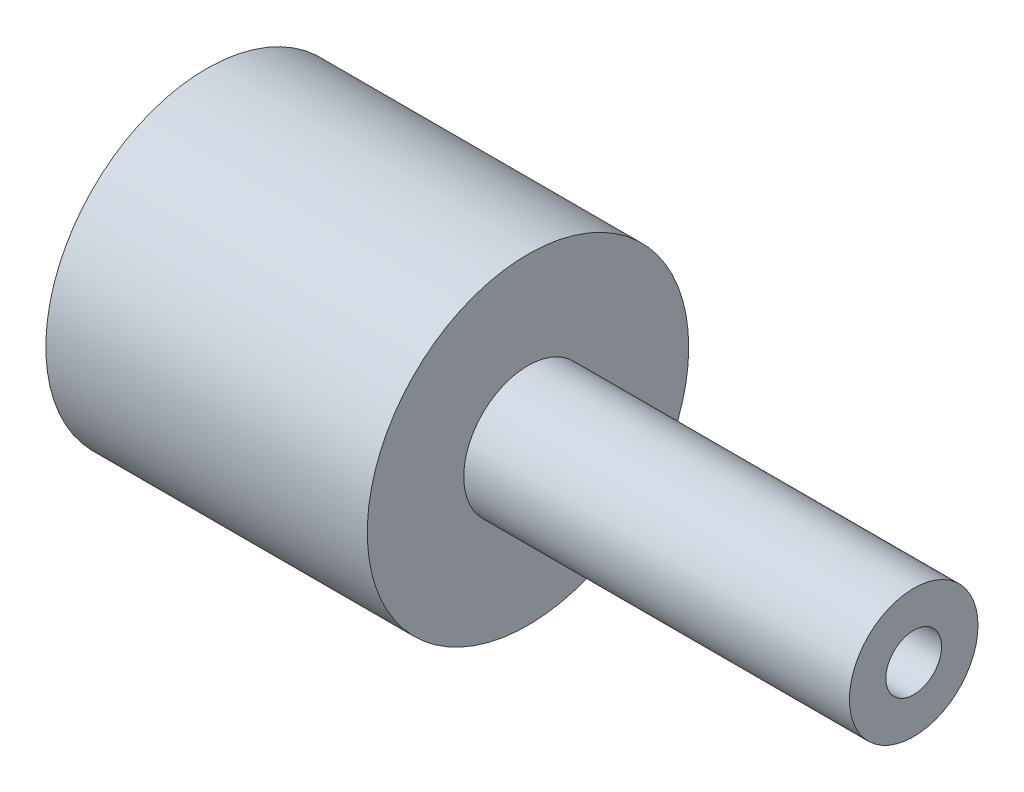
ISO-10303-21;
HEADER;
FILE_DESCRIPTION(('STEP AP214'),'2;1');
FILE_NAME('part.step','',(''),(''),'','','');
FILE_SCHEMA(('AUTOMOTIVE_DESIGN { 1 0 10303 214 1 1 1 1 }'));
ENDSEC;
DATA;
#1=APPLICATION_CONTEXT('core data for automotive mechanical design processes');
#2=APPLICATION_PROTOCOL_DEFINITION('international standard','automotive_design',2000,#1);
#3=PRODUCT_CONTEXT('',#1,'mechanical');
#4=PRODUCT('Part','Part','',(#3));
#5=PRODUCT_RELATED_PRODUCT_CATEGORY('part','',(#4));
#6=PRODUCT_DEFINITION_FORMATION('','',#4);
#7=PRODUCT_DEFINITION_CONTEXT('part definition',#1,'design');
#8=PRODUCT_DEFINITION('design','',#6,#7);
#9=PRODUCT_DEFINITION_SHAPE('','',#8);
#10=(LENGTH_UNIT() NAMED_UNIT(*) SI_UNIT(.MILLI.,.METRE.));
#11=(NAMED_UNIT(*) PLANE_ANGLE_UNIT() SI_UNIT($,.RADIAN.));
#12=(NAMED_UNIT(*) SI_UNIT($,.STERADIAN.) SOLID_ANGLE_UNIT());
#13=UNCERTAINTY_MEASURE_WITH_UNIT(LENGTH_MEASURE(1.E-05),#10,'distance_accuracy_value','');
#14=(GEOMETRIC_REPRESENTATION_CONTEXT(3) GLOBAL_UNCERTAINTY_ASSIGNED_CONTEXT((#13)) GLOBAL_UNIT_ASSIGNED_CONTEXT((#10,
#11,#12)) REPRESENTATION_CONTEXT('',''));
#15=CARTESIAN_POINT('',(0.,0.,0.));
#16=DIRECTION('',(0.,0.,1.));
#17=DIRECTION('',(1.,0.,0.));
#18=AXIS2_PLACEMENT_3D('',#15,#16,#17);
#19=CARTESIAN_POINT('',(33.,0.,0.));
#20=DIRECTION('',(-1.,0.,0.));
#21=DIRECTION('',(0.,0.,1.));
#22=AXIS2_PLACEMENT_3D('',#19,#20,#21);
#23=CYLINDRICAL_SURFACE('',#22,3.);
#24=CARTESIAN_POINT('',(15.,0.,0.));
#25=DIRECTION('',(1.,0.,0.));
#26=DIRECTION('',(0.,0.,-1.));
#27=AXIS2_PLACEMENT_3D('',#24,#25,#26);
#28=CIRCLE('',#27,3.);
#29=CARTESIAN_POINT('',(15.,0.,-3.));
#30=VERTEX_POINT('',#29);
#31=EDGE_CURVE('E59',#30,#30,#28,.T.);
#32=ORIENTED_EDGE('',*,*,#31,.T.);
#33=EDGE_LOOP('',(#32));
#34=FACE_BOUND('',#33,.T.);
#35=CARTESIAN_POINT('',(33.,0.,0.));
#36=DIRECTION('',(1.,0.,0.));
#37=DIRECTION('',(0.,0.,-1.));
#38=AXIS2_PLACEMENT_3D('',#35,#36,#37);
#39=CIRCLE('',#38,3.);
#40=CARTESIAN_POINT('',(33.,0.,-3.));
#41=VERTEX_POINT('',#40);
#42=EDGE_CURVE('E10',#41,#41,#39,.T.);
#43=ORIENTED_EDGE('',*,*,#42,.F.);
#44=EDGE_LOOP('',(#43));
#45=FACE_BOUND('',#44,.T.);
#46=ADVANCED_FACE('F33',(#34,#45),#23,.T.);
#47=CARTESIAN_POINT('',(33.,0.,0.));
#48=DIRECTION('',(1.,0.,0.));
#49=DIRECTION('',(0.,0.,-1.));
#50=AXIS2_PLACEMENT_3D('',#47,#48,#49);
#51=PLANE('',#50);
#52=CARTESIAN_POINT('',(33.,0.,0.));
#53=DIRECTION('',(1.,0.,0.));
#54=DIRECTION('',(0.,0.,-1.));
#55=AXIS2_PLACEMENT_3D('',#52,#53,#54);
#56=CIRCLE('',#55,1.3);
#57=CARTESIAN_POINT('',(33.,0.,-1.3));
#58=VERTEX_POINT('',#57);
#59=EDGE_CURVE('E43',#58,#58,#56,.T.);
#60=ORIENTED_EDGE('',*,*,#59,.F.);
#61=EDGE_LOOP('',(#60));
#62=FACE_BOUND('',#61,.T.);
#63=ORIENTED_EDGE('',*,*,#42,.T.);
#64=EDGE_LOOP('',(#63));
#65=FACE_BOUND('',#64,.T.);
#66=ADVANCED_FACE('F83',(#62,#65),#51,.T.);
#67=CARTESIAN_POINT('',(28.,0.,0.));
#68=DIRECTION('',(1.,0.,0.));
#69=DIRECTION('',(0.,0.,-1.));
#70=AXIS2_PLACEMENT_3D('',#67,#68,#69);
#71=CYLINDRICAL_SURFACE('',#70,1.3);
#72=CARTESIAN_POINT('',(28.,0.,0.));
#73=DIRECTION('',(1.,0.,0.));
#74=DIRECTION('',(0.,0.,-1.));
#75=AXIS2_PLACEMENT_3D('',#72,#73,#74);
#76=CIRCLE('',#75,1.3);
#77=CARTESIAN_POINT('',(28.,0.,-1.3));
#78=VERTEX_POINT('',#77);
#79=EDGE_CURVE('E39',#78,#78,#76,.T.);
#80=ORIENTED_EDGE('',*,*,#79,.F.);
#81=EDGE_LOOP('',(#80));
#82=FACE_BOUND('',#81,.T.);
#83=ORIENTED_EDGE('',*,*,#59,.T.);
#84=EDGE_LOOP('',(#83));
#85=FACE_BOUND('',#84,.T.);
#86=ADVANCED_FACE('F80',(#82,#85),#71,.F.);
#87=CARTESIAN_POINT('',(28.,0.,0.));
#88=DIRECTION('',(1.,0.,0.));
#89=DIRECTION('',(0.,0.,-1.));
#90=AXIS2_PLACEMENT_3D('',#87,#88,#89);
#91=PLANE('',#90);
#92=ORIENTED_EDGE('',*,*,#79,.T.);
#93=EDGE_LOOP('',(#92));
#94=FACE_BOUND('',#93,.T.);
#95=ADVANCED_FACE('F70',(#94),#91,.T.);
#96=CARTESIAN_POINT('',(15.,0.,0.));
#97=DIRECTION('',(1.,0.,0.));
#98=DIRECTION('',(0.,0.,-1.));
#99=AXIS2_PLACEMENT_3D('',#96,#97,#98);
#100=PLANE('',#99);
#101=CARTESIAN_POINT('',(15.,0.,0.));
#102=DIRECTION('',(1.,0.,0.));
#103=DIRECTION('',(0.,0.,-1.));
#104=AXIS2_PLACEMENT_3D('',#101,#102,#103);
#105=CIRCLE('',#104,7.5);
#106=CARTESIAN_POINT('',(15.,0.,-7.5));
#107=VERTEX_POINT('',#106);
#108=EDGE_CURVE('E53',#107,#107,#105,.T.);
#109=ORIENTED_EDGE('',*,*,#108,.T.);
#110=EDGE_LOOP('',(#109));
#111=FACE_BOUND('',#110,.T.);
#112=ORIENTED_EDGE('',*,*,#31,.F.);
#113=EDGE_LOOP('',(#112));
#114=FACE_BOUND('',#113,.T.);
#115=ADVANCED_FACE('F67',(#111,#114),#100,.T.);
#116=CARTESIAN_POINT('',(15.,0.,0.));
#117=DIRECTION('',(-1.,0.,0.));
#118=DIRECTION('',(0.,0.,1.));
#119=AXIS2_PLACEMENT_3D('',#116,#117,#118);
#120=CYLINDRICAL_SURFACE('',#119,7.5);
#121=ORIENTED_EDGE('',*,*,#108,.F.);
#122=EDGE_LOOP('',(#121));
#123=FACE_BOUND('',#122,.T.);
#124=CARTESIAN_POINT('',(0.,0.,0.));
#125=DIRECTION('',(1.,0.,0.));
#126=DIRECTION('',(0.,0.,-1.));
#127=AXIS2_PLACEMENT_3D('',#124,#125,#126);
#128=CIRCLE('',#127,7.5);
#129=CARTESIAN_POINT('',(0.,0.,-7.5));
#130=VERTEX_POINT('',#129);
#131=EDGE_CURVE('E56',#130,#130,#128,.T.);
#132=ORIENTED_EDGE('',*,*,#131,.T.);
#133=EDGE_LOOP('',(#132));
#134=FACE_BOUND('',#133,.T.);
#135=ADVANCED_FACE('F69',(#123,#134),#120,.T.);
#136=CARTESIAN_POINT('',(5.,0.,0.));
#137=DIRECTION('',(-1.,0.,0.));
#138=DIRECTION('',(0.,0.,1.));
#139=AXIS2_PLACEMENT_3D('',#136,#137,#138);
#140=PLANE('',#139);
#141=CARTESIAN_POINT('',(5.,0.,0.));
#142=DIRECTION('',(-1.,0.,0.));
#143=DIRECTION('',(0.,0.,1.));
#144=AXIS2_PLACEMENT_3D('',#141,#142,#143);
#145=CIRCLE('',#144,1.3);
#146=CARTESIAN_POINT('',(5.,0.,1.3));
#147=VERTEX_POINT('',#146);
#148=EDGE_CURVE('E48',#147,#147,#145,.T.);
#149=ORIENTED_EDGE('',*,*,#148,.T.);
#150=EDGE_LOOP('',(#149));
#151=FACE_BOUND('',#150,.T.);
#152=ADVANCED_FACE('F77',(#151),#140,.T.);
#153=CARTESIAN_POINT('',(5.,0.,0.));
#154=DIRECTION('',(-1.,0.,0.));
#155=DIRECTION('',(0.,0.,1.));
#156=AXIS2_PLACEMENT_3D('',#153,#154,#155);
#157=CYLINDRICAL_SURFACE('',#156,1.3);
#158=ORIENTED_EDGE('',*,*,#148,.F.);
#159=EDGE_LOOP('',(#158));
#160=FACE_BOUND('',#159,.T.);
#161=CARTESIAN_POINT('',(0.,0.,0.));
#162=DIRECTION('',(-1.,0.,0.));
#163=DIRECTION('',(0.,0.,1.));
#164=AXIS2_PLACEMENT_3D('',#161,#162,#163);
#165=CIRCLE('',#164,1.3);
#166=CARTESIAN_POINT('',(0.,0.,1.3));
#167=VERTEX_POINT('',#166);
#168=EDGE_CURVE('E50',#167,#167,#165,.T.);
#169=ORIENTED_EDGE('',*,*,#168,.T.);
#170=EDGE_LOOP('',(#169));
#171=FACE_BOUND('',#170,.T.);
#172=ADVANCED_FACE('F97',(#160,#171),#157,.F.);
#173=CARTESIAN_POINT('',(0.,0.,0.));
#174=DIRECTION('',(1.,0.,0.));
#175=DIRECTION('',(0.,0.,-1.));
#176=AXIS2_PLACEMENT_3D('',#173,#174,#175);
#177=PLANE('',#176);
#178=ORIENTED_EDGE('',*,*,#168,.F.);
#179=EDGE_LOOP('',(#178));
#180=FACE_BOUND('',#179,.T.);
#181=ORIENTED_EDGE('',*,*,#131,.F.);
#182=EDGE_LOOP('',(#181));
#183=FACE_BOUND('',#182,.T.);
#184=ADVANCED_FACE('F95',(#180,#183),#177,.F.);
#185=CLOSED_SHELL('',(#46,#66,#86,#95,#115,#135,#152,#172,#184));
#186=MANIFOLD_SOLID_BREP('B2',#185);
#187=ADVANCED_BREP_SHAPE_REPRESENTATION('',(#18,#186),#14);
#188=SHAPE_DEFINITION_REPRESENTATION(#9,#187);
ENDSEC;
END-ISO-10303-21;
